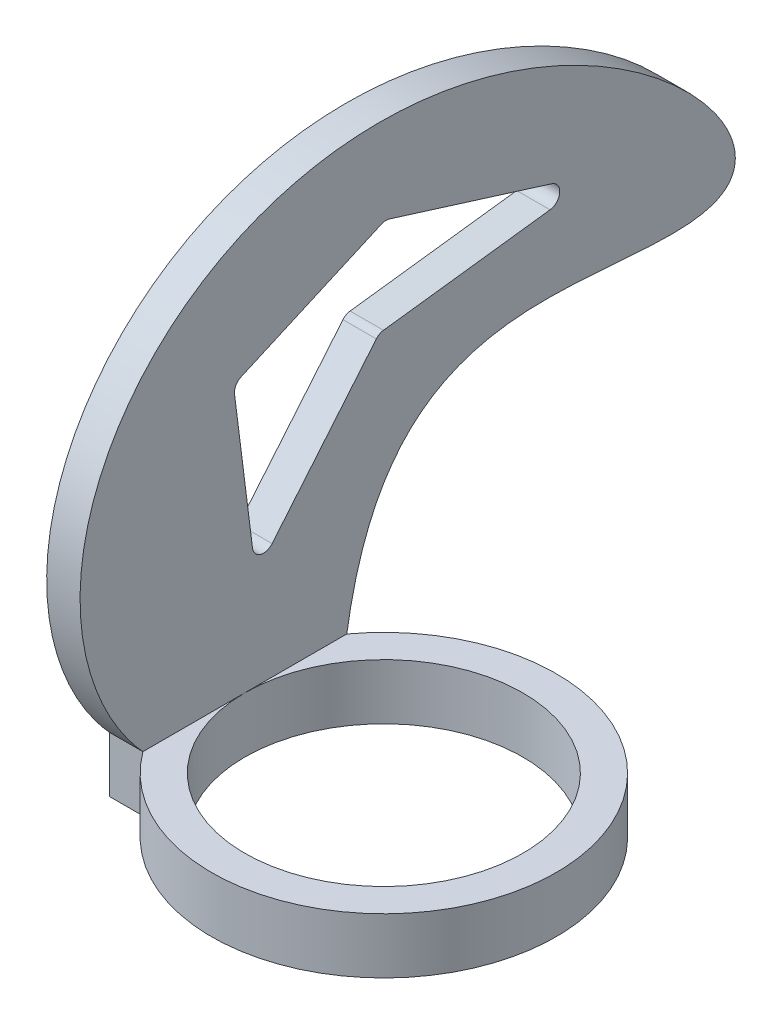
ISO-10303-21;
HEADER;
FILE_DESCRIPTION(('STEP AP214'),'2;1');
FILE_NAME('part.step','',(''),(''),'','','');
FILE_SCHEMA(('AUTOMOTIVE_DESIGN { 1 0 10303 214 1 1 1 1 }'));
ENDSEC;
DATA;
#1=APPLICATION_CONTEXT('core data for automotive mechanical design processes');
#2=APPLICATION_PROTOCOL_DEFINITION('international standard','automotive_design',2000,#1);
#3=PRODUCT_CONTEXT('',#1,'mechanical');
#4=PRODUCT('Part','Part','',(#3));
#5=PRODUCT_RELATED_PRODUCT_CATEGORY('part','',(#4));
#6=PRODUCT_DEFINITION_FORMATION('','',#4);
#7=PRODUCT_DEFINITION_CONTEXT('part definition',#1,'design');
#8=PRODUCT_DEFINITION('design','',#6,#7);
#9=PRODUCT_DEFINITION_SHAPE('','',#8);
#10=(LENGTH_UNIT() NAMED_UNIT(*) SI_UNIT(.MILLI.,.METRE.));
#11=(NAMED_UNIT(*) PLANE_ANGLE_UNIT() SI_UNIT($,.RADIAN.));
#12=(NAMED_UNIT(*) SI_UNIT($,.STERADIAN.) SOLID_ANGLE_UNIT());
#13=UNCERTAINTY_MEASURE_WITH_UNIT(LENGTH_MEASURE(1.E-05),#10,'distance_accuracy_value','');
#14=(GEOMETRIC_REPRESENTATION_CONTEXT(3) GLOBAL_UNCERTAINTY_ASSIGNED_CONTEXT((#13)) GLOBAL_UNIT_ASSIGNED_CONTEXT((#10,
#11,#12)) REPRESENTATION_CONTEXT('',''));
#15=CARTESIAN_POINT('',(0.,0.,0.));
#16=DIRECTION('',(0.,0.,1.));
#17=DIRECTION('',(1.,0.,0.));
#18=AXIS2_PLACEMENT_3D('',#15,#16,#17);
#19=CARTESIAN_POINT('',(0.,2.5,0.));
#20=DIRECTION('',(0.,-1.,0.));
#21=DIRECTION('',(0.,0.,-1.));
#22=AXIS2_PLACEMENT_3D('',#19,#20,#21);
#23=CYLINDRICAL_SURFACE('',#22,7.75);
#24=DIRECTION('',(0.,1.,0.));
#25=VECTOR('',#24,1.);
#26=CARTESIAN_POINT('',(-6.25,0.,4.58257569495584));
#27=LINE('',#26,#25);
#28=CARTESIAN_POINT('',(-6.25,0.,4.58257569495584));
#29=VERTEX_POINT('',#28);
#30=CARTESIAN_POINT('',(-6.25,2.5,4.58257569495584));
#31=VERTEX_POINT('',#30);
#32=EDGE_CURVE('E159',#29,#31,#27,.T.);
#33=ORIENTED_EDGE('',*,*,#32,.F.);
#34=CARTESIAN_POINT('',(0.,0.,0.));
#35=DIRECTION('',(0.,1.,0.));
#36=DIRECTION('',(0.,0.,1.));
#37=AXIS2_PLACEMENT_3D('',#34,#35,#36);
#38=CIRCLE('',#37,7.75);
#39=CARTESIAN_POINT('',(-6.25,0.,-4.58257569495584));
#40=VERTEX_POINT('',#39);
#41=EDGE_CURVE('E181',#29,#40,#38,.T.);
#42=ORIENTED_EDGE('',*,*,#41,.T.);
#43=DIRECTION('',(0.,1.,0.));
#44=VECTOR('',#43,1.);
#45=CARTESIAN_POINT('',(-6.25,0.,-4.58257569495584));
#46=LINE('',#45,#44);
#47=CARTESIAN_POINT('',(-6.25,2.5,-4.58257569495584));
#48=VERTEX_POINT('',#47);
#49=EDGE_CURVE('E180',#40,#48,#46,.T.);
#50=ORIENTED_EDGE('',*,*,#49,.T.);
#51=CARTESIAN_POINT('',(0.,2.5,0.));
#52=DIRECTION('',(0.,1.,0.));
#53=DIRECTION('',(0.,0.,1.));
#54=AXIS2_PLACEMENT_3D('',#51,#52,#53);
#55=CIRCLE('',#54,7.75);
#56=EDGE_CURVE('E173',#31,#48,#55,.T.);
#57=ORIENTED_EDGE('',*,*,#56,.F.);
#58=EDGE_LOOP('',(#33,#42,#50,#57));
#59=FACE_BOUND('',#58,.T.);
#60=ADVANCED_FACE('F33',(#59),#23,.T.);
#61=CARTESIAN_POINT('',(0.,2.5,0.));
#62=DIRECTION('',(0.,1.,0.));
#63=DIRECTION('',(0.,0.,1.));
#64=AXIS2_PLACEMENT_3D('',#61,#62,#63);
#65=PLANE('',#64);
#66=DIRECTION('',(0.,0.,-1.));
#67=VECTOR('',#66,1.);
#68=CARTESIAN_POINT('',(-6.25,2.5,-27.));
#69=LINE('',#68,#67);
#70=CARTESIAN_POINT('',(-6.25,2.5,0.));
#71=VERTEX_POINT('',#70);
#72=EDGE_CURVE('E155',#31,#71,#69,.T.);
#73=ORIENTED_EDGE('',*,*,#72,.F.);
#74=ORIENTED_EDGE('',*,*,#56,.T.);
#75=EDGE_CURVE('E156',#71,#48,#69,.T.);
#76=ORIENTED_EDGE('',*,*,#75,.F.);
#77=CARTESIAN_POINT('',(0.,2.5,0.));
#78=DIRECTION('',(0.,1.,0.));
#79=DIRECTION('',(0.,0.,1.));
#80=AXIS2_PLACEMENT_3D('',#77,#78,#79);
#81=CIRCLE('',#80,6.25);
#82=EDGE_CURVE('E175',#71,#71,#81,.T.);
#83=ORIENTED_EDGE('',*,*,#82,.F.);
#84=EDGE_LOOP('',(#73,#74,#76,#83));
#85=FACE_BOUND('',#84,.T.);
#86=ADVANCED_FACE('F172',(#85),#65,.T.);
#87=CARTESIAN_POINT('',(0.,0.,0.));
#88=DIRECTION('',(0.,1.,0.));
#89=DIRECTION('',(0.,0.,1.));
#90=AXIS2_PLACEMENT_3D('',#87,#88,#89);
#91=PLANE('',#90);
#92=CARTESIAN_POINT('',(0.,0.,0.));
#93=DIRECTION('',(0.,1.,0.));
#94=DIRECTION('',(0.,0.,1.));
#95=AXIS2_PLACEMENT_3D('',#92,#93,#94);
#96=CIRCLE('',#95,6.25);
#97=CARTESIAN_POINT('',(0.,0.,6.25));
#98=VERTEX_POINT('',#97);
#99=EDGE_CURVE('E166',#98,#98,#96,.T.);
#100=ORIENTED_EDGE('',*,*,#99,.T.);
#101=EDGE_LOOP('',(#100));
#102=FACE_BOUND('',#101,.T.);
#103=DIRECTION('',(1.,0.,0.));
#104=VECTOR('',#103,1.);
#105=CARTESIAN_POINT('',(-6.25,0.,-4.58257569495584));
#106=LINE('',#105,#104);
#107=CARTESIAN_POINT('',(-7.75,0.,-4.58257569495584));
#108=VERTEX_POINT('',#107);
#109=EDGE_CURVE('E470',#108,#40,#106,.T.);
#110=ORIENTED_EDGE('',*,*,#109,.T.);
#111=ORIENTED_EDGE('',*,*,#41,.F.);
#112=DIRECTION('',(-1.,0.,0.));
#113=VECTOR('',#112,1.);
#114=CARTESIAN_POINT('',(-6.25,0.,4.58257569495584));
#115=LINE('',#114,#113);
#116=CARTESIAN_POINT('',(-7.75,0.,4.58257569495584));
#117=VERTEX_POINT('',#116);
#118=EDGE_CURVE('E161',#29,#117,#115,.T.);
#119=ORIENTED_EDGE('',*,*,#118,.T.);
#120=DIRECTION('',(0.,0.,-1.));
#121=VECTOR('',#120,1.);
#122=CARTESIAN_POINT('',(-7.75,0.,-4.58257569495584));
#123=LINE('',#122,#121);
#124=EDGE_CURVE('E472',#117,#108,#123,.T.);
#125=ORIENTED_EDGE('',*,*,#124,.T.);
#126=EDGE_LOOP('',(#110,#111,#119,#125));
#127=FACE_BOUND('',#126,.T.);
#128=ADVANCED_FACE('F295',(#102,#127),#91,.F.);
#129=CARTESIAN_POINT('',(0.,2.5,0.));
#130=DIRECTION('',(0.,-1.,0.));
#131=DIRECTION('',(0.,0.,-1.));
#132=AXIS2_PLACEMENT_3D('',#129,#130,#131);
#133=CYLINDRICAL_SURFACE('',#132,6.25);
#134=ORIENTED_EDGE('',*,*,#99,.F.);
#135=EDGE_LOOP('',(#134));
#136=FACE_BOUND('',#135,.T.);
#137=ORIENTED_EDGE('',*,*,#82,.T.);
#138=EDGE_LOOP('',(#137));
#139=FACE_BOUND('',#138,.T.);
#140=ADVANCED_FACE('F292',(#136,#139),#133,.F.);
#141=CARTESIAN_POINT('',(-6.25,22.5,-27.));
#142=DIRECTION('',(-1.,0.,0.));
#143=DIRECTION('',(0.,0.,1.));
#144=AXIS2_PLACEMENT_3D('',#141,#142,#143);
#145=PLANE('',#144);
#146=DIRECTION('',(0.,-0.125360280156999,0.992111284160683));
#147=VECTOR('',#146,1.);
#148=CARTESIAN_POINT('',(-6.25,14.735802895455,-16.0040110855277));
#149=LINE('',#148,#147);
#150=CARTESIAN_POINT('',(-6.25,14.4474353196458,-13.7218470253644));
#151=VERTEX_POINT('',#150);
#152=CARTESIAN_POINT('',(-6.25,13.5011083094265,-6.23253937409876));
#153=VERTEX_POINT('',#152);
#154=EDGE_CURVE('E241',#151,#153,#149,.T.);
#155=ORIENTED_EDGE('',*,*,#154,.T.);
#156=CARTESIAN_POINT('',(-6.25,13.0050526673462,-6.29521951417726));
#157=DIRECTION('',(-1.,0.,0.));
#158=DIRECTION('',(0.,0.,1.));
#159=AXIS2_PLACEMENT_3D('',#156,#157,#158);
#160=CIRCLE('',#159,0.5);
#161=CARTESIAN_POINT('',(-6.25,13.324994836851,-5.91098389873732));
#162=VERTEX_POINT('',#161);
#163=EDGE_CURVE('E203',#153,#162,#160,.F.);
#164=ORIENTED_EDGE('',*,*,#163,.T.);
#165=DIRECTION('',(0.,-0.76847123087988,0.639884339009763));
#166=VECTOR('',#165,1.);
#167=CARTESIAN_POINT('',(-6.25,13.47640831397,-6.03706163441586));
#168=LINE('',#167,#166);
#169=CARTESIAN_POINT('',(-6.25,7.69809557974773,-1.22562344915546));
#170=VERTEX_POINT('',#169);
#171=EDGE_CURVE('E247',#162,#170,#168,.T.);
#172=ORIENTED_EDGE('',*,*,#171,.T.);
#173=CARTESIAN_POINT('',(-6.25,8.01803774925262,-0.84138783371552));
#174=DIRECTION('',(-1.,0.,0.));
#175=DIRECTION('',(0.,0.,1.));
#176=AXIS2_PLACEMENT_3D('',#173,#174,#175);
#177=CIRCLE('',#176,0.5);
#178=CARTESIAN_POINT('',(-6.25,7.95535760917411,-0.345332191635179));
#179=VERTEX_POINT('',#178);
#180=EDGE_CURVE('E216',#170,#179,#177,.T.);
#181=ORIENTED_EDGE('',*,*,#180,.T.);
#182=DIRECTION('',(0.,0.992111284160683,0.125360280156999));
#183=VECTOR('',#182,1.);
#184=CARTESIAN_POINT('',(-6.25,6.8140926227116,-0.489539097372926));
#185=LINE('',#184,#183);
#186=CARTESIAN_POINT('',(-6.25,14.3664635917885,0.464756409238536));
#187=VERTEX_POINT('',#186);
#188=EDGE_CURVE('E250',#179,#187,#185,.T.);
#189=ORIENTED_EDGE('',*,*,#188,.T.);
#190=CARTESIAN_POINT('',(-6.25,14.429143731867,-0.0312992328418052));
#191=DIRECTION('',(-1.,0.,0.));
#192=DIRECTION('',(0.,0.,1.));
#193=AXIS2_PLACEMENT_3D('',#190,#191,#192);
#194=CIRCLE('',#193,0.5);
#195=CARTESIAN_POINT('',(-6.25,14.8864037271411,0.170971122677603));
#196=VERTEX_POINT('',#195);
#197=EDGE_CURVE('E220',#187,#196,#194,.T.);
#198=ORIENTED_EDGE('',*,*,#197,.T.);
#199=DIRECTION('',(0.,0.404540711038818,-0.91451999054816));
#200=VECTOR('',#199,1.);
#201=CARTESIAN_POINT('',(-6.25,14.735802895455,0.511425043412761));
#202=LINE('',#201,#200);
#203=CARTESIAN_POINT('',(-6.25,17.6810722521514,-6.14676195915422));
#204=VERTEX_POINT('',#203);
#205=EDGE_CURVE('E257',#196,#204,#202,.T.);
#206=ORIENTED_EDGE('',*,*,#205,.T.);
#207=CARTESIAN_POINT('',(-6.25,17.2238122568774,-6.34903231467363));
#208=DIRECTION('',(-1.,0.,0.));
#209=DIRECTION('',(0.,0.,1.));
#210=AXIS2_PLACEMENT_3D('',#207,#208,#209);
#211=CIRCLE('',#210,0.5);
#212=CARTESIAN_POINT('',(-6.25,17.7011283212104,-6.49792615178464));
#213=VERTEX_POINT('',#212);
#214=EDGE_CURVE('E55',#204,#213,#211,.T.);
#215=ORIENTED_EDGE('',*,*,#214,.T.);
#216=DIRECTION('',(0.,-0.297787674222027,-0.95463212866603));
#217=VECTOR('',#216,1.);
#218=CARTESIAN_POINT('',(-6.25,17.7570747405085,-6.31857605112884));
#219=LINE('',#218,#217);
#220=CARTESIAN_POINT('',(-6.25,15.4208070260592,-13.808060722397));
#221=VERTEX_POINT('',#220);
#222=EDGE_CURVE('E243',#213,#221,#219,.T.);
#223=ORIENTED_EDGE('',*,*,#222,.T.);
#224=CARTESIAN_POINT('',(-6.25,14.9434909617262,-13.6591668852859));
#225=DIRECTION('',(-1.,0.,0.));
#226=DIRECTION('',(0.,0.,1.));
#227=AXIS2_PLACEMENT_3D('',#224,#225,#226);
#228=CIRCLE('',#227,0.5);
#229=EDGE_CURVE('E11',#221,#151,#228,.T.);
#230=ORIENTED_EDGE('',*,*,#229,.T.);
#231=EDGE_LOOP('',(#155,#164,#172,#181,#189,#198,#206,#215,#223,#230));
#232=FACE_BOUND('',#231,.T.);
#233=ORIENTED_EDGE('',*,*,#75,.T.);
#234=CARTESIAN_POINT('',(-6.25,2.5,-4.58257569495584));
#235=CARTESIAN_POINT('',(-6.25,7.388757929224,-5.37555513974919));
#236=CARTESIAN_POINT('',(-6.25,17.9231020818627,-8.0761084256471));
#237=CARTESIAN_POINT('',(-6.25,15.2616923756117,-16.120207129994));
#238=CARTESIAN_POINT('',(-6.25,-0.0330722990327104,-31.4505619723562));
#239=CARTESIAN_POINT('',(-6.25,1.04473030731711,-33.3627441128845));
#240=CARTESIAN_POINT('',(-6.25,30.2633435600868,-22.7002608783238));
#241=CARTESIAN_POINT('',(-6.25,34.1189058818792,-4.9954181113927));
#242=CARTESIAN_POINT('',(-6.25,20.7559509515711,5.36816856320854));
#243=CARTESIAN_POINT('',(-6.25,17.4811110900972,9.6112144679168));
#244=CARTESIAN_POINT('',(-6.25,7.9856512308929,9.6112144679168));
#245=CARTESIAN_POINT('',(-6.25,2.5,4.58257569495584));
#246=B_SPLINE_CURVE_WITH_KNOTS('',11,(#234,#235,#236,#237,#238,#239,#240,#241,#242,#243,#244,
#245),.UNSPECIFIED.,.F.,.F.,(12,12),(0.,1.),.UNSPECIFIED.);
#247=EDGE_CURVE('E140',#48,#31,#246,.T.);
#248=ORIENTED_EDGE('',*,*,#247,.T.);
#249=ORIENTED_EDGE('',*,*,#72,.T.);
#250=EDGE_LOOP('',(#233,#248,#249));
#251=FACE_BOUND('',#250,.T.);
#252=ADVANCED_FACE('F153',(#232,#251),#145,.F.);
#253=CARTESIAN_POINT('',(-7.75,22.5,-27.));
#254=DIRECTION('',(1.,0.,0.));
#255=DIRECTION('',(0.,0.,-1.));
#256=AXIS2_PLACEMENT_3D('',#253,#254,#255);
#257=PLANE('',#256);
#258=DIRECTION('',(0.,-0.76847123087988,0.639884339009763));
#259=VECTOR('',#258,1.);
#260=CARTESIAN_POINT('',(-7.75,13.47640831397,-6.03706163441586));
#261=LINE('',#260,#259);
#262=CARTESIAN_POINT('',(-7.75,13.324994836851,-5.91098389873732));
#263=VERTEX_POINT('',#262);
#264=CARTESIAN_POINT('',(-7.75,7.69809557974773,-1.22562344915546));
#265=VERTEX_POINT('',#264);
#266=EDGE_CURVE('E260',#263,#265,#261,.T.);
#267=ORIENTED_EDGE('',*,*,#266,.F.);
#268=CARTESIAN_POINT('',(-7.75,13.0050526673462,-6.29521951417726));
#269=DIRECTION('',(1.,0.,0.));
#270=DIRECTION('',(0.,0.,-1.));
#271=AXIS2_PLACEMENT_3D('',#268,#269,#270);
#272=CIRCLE('',#271,0.5);
#273=CARTESIAN_POINT('',(-7.75,13.5011083094265,-6.23253937409876));
#274=VERTEX_POINT('',#273);
#275=EDGE_CURVE('E196',#263,#274,#272,.F.);
#276=ORIENTED_EDGE('',*,*,#275,.T.);
#277=DIRECTION('',(0.,-0.125360280156999,0.992111284160683));
#278=VECTOR('',#277,1.);
#279=CARTESIAN_POINT('',(-7.75,14.735802895455,-16.0040110855277));
#280=LINE('',#279,#278);
#281=CARTESIAN_POINT('',(-7.75,14.4474353196458,-13.7218470253644));
#282=VERTEX_POINT('',#281);
#283=EDGE_CURVE('E232',#282,#274,#280,.T.);
#284=ORIENTED_EDGE('',*,*,#283,.F.);
#285=CARTESIAN_POINT('',(-7.75,14.9434909617262,-13.6591668852859));
#286=DIRECTION('',(1.,0.,0.));
#287=DIRECTION('',(0.,0.,-1.));
#288=AXIS2_PLACEMENT_3D('',#285,#286,#287);
#289=CIRCLE('',#288,0.5);
#290=CARTESIAN_POINT('',(-7.75,15.4208070260592,-13.808060722397));
#291=VERTEX_POINT('',#290);
#292=EDGE_CURVE('E41',#282,#291,#289,.T.);
#293=ORIENTED_EDGE('',*,*,#292,.T.);
#294=DIRECTION('',(0.,-0.297787674222027,-0.95463212866603));
#295=VECTOR('',#294,1.);
#296=CARTESIAN_POINT('',(-7.75,17.7570747405085,-6.31857605112884));
#297=LINE('',#296,#295);
#298=CARTESIAN_POINT('',(-7.75,17.7011283212104,-6.49792615178464));
#299=VERTEX_POINT('',#298);
#300=EDGE_CURVE('E230',#299,#291,#297,.T.);
#301=ORIENTED_EDGE('',*,*,#300,.F.);
#302=CARTESIAN_POINT('',(-7.75,17.2238122568774,-6.34903231467363));
#303=DIRECTION('',(1.,0.,0.));
#304=DIRECTION('',(0.,0.,-1.));
#305=AXIS2_PLACEMENT_3D('',#302,#303,#304);
#306=CIRCLE('',#305,0.5);
#307=CARTESIAN_POINT('',(-7.75,17.6810722521514,-6.14676195915422));
#308=VERTEX_POINT('',#307);
#309=EDGE_CURVE('E222',#299,#308,#306,.T.);
#310=ORIENTED_EDGE('',*,*,#309,.T.);
#311=DIRECTION('',(0.,0.404540711038818,-0.91451999054816));
#312=VECTOR('',#311,1.);
#313=CARTESIAN_POINT('',(-7.75,14.735802895455,0.511425043412762));
#314=LINE('',#313,#312);
#315=CARTESIAN_POINT('',(-7.75,14.8864037271411,0.170971122677603));
#316=VERTEX_POINT('',#315);
#317=EDGE_CURVE('E252',#316,#308,#314,.T.);
#318=ORIENTED_EDGE('',*,*,#317,.F.);
#319=CARTESIAN_POINT('',(-7.75,14.429143731867,-0.031299232841805));
#320=DIRECTION('',(1.,0.,0.));
#321=DIRECTION('',(0.,0.,-1.));
#322=AXIS2_PLACEMENT_3D('',#319,#320,#321);
#323=CIRCLE('',#322,0.5);
#324=CARTESIAN_POINT('',(-7.75,14.3664635917885,0.464756409238536));
#325=VERTEX_POINT('',#324);
#326=EDGE_CURVE('E218',#316,#325,#323,.T.);
#327=ORIENTED_EDGE('',*,*,#326,.T.);
#328=DIRECTION('',(0.,0.992111284160683,0.125360280156999));
#329=VECTOR('',#328,1.);
#330=CARTESIAN_POINT('',(-7.75,6.8140926227116,-0.489539097372925));
#331=LINE('',#330,#329);
#332=CARTESIAN_POINT('',(-7.75,7.95535760917411,-0.345332191635179));
#333=VERTEX_POINT('',#332);
#334=EDGE_CURVE('E263',#333,#325,#331,.T.);
#335=ORIENTED_EDGE('',*,*,#334,.F.);
#336=CARTESIAN_POINT('',(-7.75,8.01803774925262,-0.84138783371552));
#337=DIRECTION('',(1.,0.,0.));
#338=DIRECTION('',(0.,0.,-1.));
#339=AXIS2_PLACEMENT_3D('',#336,#337,#338);
#340=CIRCLE('',#339,0.5);
#341=EDGE_CURVE('E214',#333,#265,#340,.T.);
#342=ORIENTED_EDGE('',*,*,#341,.T.);
#343=EDGE_LOOP('',(#267,#276,#284,#293,#301,#310,#318,#327,#335,#342));
#344=FACE_BOUND('',#343,.T.);
#345=DIRECTION('',(0.,1.,0.));
#346=VECTOR('',#345,1.);
#347=CARTESIAN_POINT('',(-7.75,0.,4.58257569495584));
#348=LINE('',#347,#346);
#349=CARTESIAN_POINT('',(-7.75,2.5,4.58257569495584));
#350=VERTEX_POINT('',#349);
#351=EDGE_CURVE('E167',#117,#350,#348,.T.);
#352=ORIENTED_EDGE('',*,*,#351,.T.);
#353=CARTESIAN_POINT('',(-7.75,2.5,-4.58257569495584));
#354=CARTESIAN_POINT('',(-7.75,7.388757929224,-5.37555513974919));
#355=CARTESIAN_POINT('',(-7.75,17.9231020818627,-8.0761084256471));
#356=CARTESIAN_POINT('',(-7.75,15.2616923756117,-16.120207129994));
#357=CARTESIAN_POINT('',(-7.75,-0.0330722990327104,-31.4505619723562));
#358=CARTESIAN_POINT('',(-7.75,1.04473030731711,-33.3627441128845));
#359=CARTESIAN_POINT('',(-7.75,30.2633435600868,-22.7002608783238));
#360=CARTESIAN_POINT('',(-7.75,34.1189058818792,-4.9954181113927));
#361=CARTESIAN_POINT('',(-7.75,20.7559509515711,5.36816856320854));
#362=CARTESIAN_POINT('',(-7.75,17.4811110900972,9.6112144679168));
#363=CARTESIAN_POINT('',(-7.75,7.9856512308929,9.6112144679168));
#364=CARTESIAN_POINT('',(-7.75,2.5,4.58257569495584));
#365=B_SPLINE_CURVE_WITH_KNOTS('',11,(#353,#354,#355,#356,#357,#358,#359,#360,#361,#362,#363,
#364),.UNSPECIFIED.,.F.,.F.,(12,12),(0.,1.),.UNSPECIFIED.);
#366=CARTESIAN_POINT('',(-7.75,2.5,-4.58257569495584));
#367=VERTEX_POINT('',#366);
#368=EDGE_CURVE('E143',#367,#350,#365,.T.);
#369=ORIENTED_EDGE('',*,*,#368,.F.);
#370=DIRECTION('',(0.,1.,0.));
#371=VECTOR('',#370,1.);
#372=CARTESIAN_POINT('',(-7.75,0.,-4.58257569495584));
#373=LINE('',#372,#371);
#374=EDGE_CURVE('E476',#108,#367,#373,.T.);
#375=ORIENTED_EDGE('',*,*,#374,.F.);
#376=ORIENTED_EDGE('',*,*,#124,.F.);
#377=EDGE_LOOP('',(#352,#369,#375,#376));
#378=FACE_BOUND('',#377,.T.);
#379=ADVANCED_FACE('F228',(#344,#378),#257,.F.);
#380=CARTESIAN_POINT('',(-6.25,0.,4.58257569495584));
#381=DIRECTION('',(0.,0.,-1.));
#382=DIRECTION('',(-1.,0.,0.));
#383=AXIS2_PLACEMENT_3D('',#380,#381,#382);
#384=PLANE('',#383);
#385=DIRECTION('',(-1.,0.,0.));
#386=VECTOR('',#385,1.);
#387=CARTESIAN_POINT('',(-6.25,2.5,4.58257569495584));
#388=LINE('',#387,#386);
#389=EDGE_CURVE('E137',#31,#350,#388,.T.);
#390=ORIENTED_EDGE('',*,*,#389,.T.);
#391=ORIENTED_EDGE('',*,*,#351,.F.);
#392=ORIENTED_EDGE('',*,*,#118,.F.);
#393=ORIENTED_EDGE('',*,*,#32,.T.);
#394=EDGE_LOOP('',(#390,#391,#392,#393));
#395=FACE_BOUND('',#394,.T.);
#396=ADVANCED_FACE('F160',(#395),#384,.F.);
#397=CARTESIAN_POINT('',(-6.25,0.,-4.58257569495584));
#398=DIRECTION('',(0.,0.,1.));
#399=DIRECTION('',(1.,0.,0.));
#400=AXIS2_PLACEMENT_3D('',#397,#398,#399);
#401=PLANE('',#400);
#402=DIRECTION('',(1.,0.,0.));
#403=VECTOR('',#402,1.);
#404=CARTESIAN_POINT('',(-6.25,2.5,-4.58257569495584));
#405=LINE('',#404,#403);
#406=EDGE_CURVE('E148',#367,#48,#405,.T.);
#407=ORIENTED_EDGE('',*,*,#406,.T.);
#408=ORIENTED_EDGE('',*,*,#49,.F.);
#409=ORIENTED_EDGE('',*,*,#109,.F.);
#410=ORIENTED_EDGE('',*,*,#374,.T.);
#411=EDGE_LOOP('',(#407,#408,#409,#410));
#412=FACE_BOUND('',#411,.T.);
#413=ADVANCED_FACE('F281',(#412),#401,.F.);
#414=DIRECTION('',(-1.,0.,0.));
#415=VECTOR('',#414,1.);
#416=SURFACE_OF_LINEAR_EXTRUSION('',#246,#415);
#417=ORIENTED_EDGE('',*,*,#368,.T.);
#418=ORIENTED_EDGE('',*,*,#389,.F.);
#419=ORIENTED_EDGE('',*,*,#247,.F.);
#420=ORIENTED_EDGE('',*,*,#406,.F.);
#421=EDGE_LOOP('',(#417,#418,#419,#420));
#422=FACE_BOUND('',#421,.T.);
#423=ADVANCED_FACE('F139',(#422),#416,.F.);
#424=CARTESIAN_POINT('',(-6.25,17.7570747405085,-6.31857605112884));
#425=DIRECTION('',(0.,0.95463212866603,-0.297787674222027));
#426=DIRECTION('',(0.,0.297787674222027,0.95463212866603));
#427=AXIS2_PLACEMENT_3D('',#424,#425,#426);
#428=PLANE('',#427);
#429=ORIENTED_EDGE('',*,*,#222,.F.);
#430=DIRECTION('',(-1.,0.,0.));
#431=VECTOR('',#430,1.);
#432=CARTESIAN_POINT('',(-7.75,17.7011283212104,-6.49792615178464));
#433=LINE('',#432,#431);
#434=EDGE_CURVE('E211',#213,#299,#433,.T.);
#435=ORIENTED_EDGE('',*,*,#434,.T.);
#436=ORIENTED_EDGE('',*,*,#300,.T.);
#437=DIRECTION('',(-1.,0.,0.));
#438=VECTOR('',#437,1.);
#439=CARTESIAN_POINT('',(-6.25,15.4208070260592,-13.808060722397));
#440=LINE('',#439,#438);
#441=EDGE_CURVE('E48',#291,#221,#440,.F.);
#442=ORIENTED_EDGE('',*,*,#441,.T.);
#443=EDGE_LOOP('',(#429,#435,#436,#442));
#444=FACE_BOUND('',#443,.T.);
#445=ADVANCED_FACE('F235',(#444),#428,.F.);
#446=CARTESIAN_POINT('',(-6.25,14.735802895455,0.511425043412761));
#447=DIRECTION('',(0.,0.91451999054816,0.404540711038818));
#448=DIRECTION('',(0.,-0.404540711038818,0.91451999054816));
#449=AXIS2_PLACEMENT_3D('',#446,#447,#448);
#450=PLANE('',#449);
#451=ORIENTED_EDGE('',*,*,#205,.F.);
#452=DIRECTION('',(-1.,0.,0.));
#453=VECTOR('',#452,1.);
#454=CARTESIAN_POINT('',(-7.75,14.8864037271411,0.170971122677604));
#455=LINE('',#454,#453);
#456=EDGE_CURVE('E207',#196,#316,#455,.T.);
#457=ORIENTED_EDGE('',*,*,#456,.T.);
#458=ORIENTED_EDGE('',*,*,#317,.T.);
#459=DIRECTION('',(-1.,0.,0.));
#460=VECTOR('',#459,1.);
#461=CARTESIAN_POINT('',(-6.25,17.6810722521514,-6.14676195915422));
#462=LINE('',#461,#460);
#463=EDGE_CURVE('E205',#308,#204,#462,.F.);
#464=ORIENTED_EDGE('',*,*,#463,.T.);
#465=EDGE_LOOP('',(#451,#457,#458,#464));
#466=FACE_BOUND('',#465,.T.);
#467=ADVANCED_FACE('F325',(#466),#450,.F.);
#468=CARTESIAN_POINT('',(-6.25,6.8140926227116,-0.489539097372926));
#469=DIRECTION('',(0.,-0.125360280156999,0.992111284160683));
#470=DIRECTION('',(0.,-0.992111284160683,-0.125360280156999));
#471=AXIS2_PLACEMENT_3D('',#468,#469,#470);
#472=PLANE('',#471);
#473=ORIENTED_EDGE('',*,*,#188,.F.);
#474=DIRECTION('',(-1.,0.,0.));
#475=VECTOR('',#474,1.);
#476=CARTESIAN_POINT('',(-7.75,7.95535760917411,-0.345332191635179));
#477=LINE('',#476,#475);
#478=EDGE_CURVE('E188',#179,#333,#477,.T.);
#479=ORIENTED_EDGE('',*,*,#478,.T.);
#480=ORIENTED_EDGE('',*,*,#334,.T.);
#481=DIRECTION('',(-1.,0.,0.));
#482=VECTOR('',#481,1.);
#483=CARTESIAN_POINT('',(-6.25,14.3664635917885,0.464756409238536));
#484=LINE('',#483,#482);
#485=EDGE_CURVE('E176',#325,#187,#484,.F.);
#486=ORIENTED_EDGE('',*,*,#485,.T.);
#487=EDGE_LOOP('',(#473,#479,#480,#486));
#488=FACE_BOUND('',#487,.T.);
#489=ADVANCED_FACE('F332',(#488),#472,.F.);
#490=CARTESIAN_POINT('',(-6.25,13.47640831397,-6.03706163441586));
#491=DIRECTION('',(0.,-0.639884339009763,-0.76847123087988));
#492=DIRECTION('',(0.,0.768471230879881,-0.639884339009763));
#493=AXIS2_PLACEMENT_3D('',#490,#491,#492);
#494=PLANE('',#493);
#495=ORIENTED_EDGE('',*,*,#266,.T.);
#496=DIRECTION('',(-1.,0.,0.));
#497=VECTOR('',#496,1.);
#498=CARTESIAN_POINT('',(-6.25,7.69809557974773,-1.22562344915546));
#499=LINE('',#498,#497);
#500=EDGE_CURVE('E194',#265,#170,#499,.F.);
#501=ORIENTED_EDGE('',*,*,#500,.T.);
#502=ORIENTED_EDGE('',*,*,#171,.F.);
#503=DIRECTION('',(-1.,0.,0.));
#504=VECTOR('',#503,1.);
#505=CARTESIAN_POINT('',(-6.25,13.324994836851,-5.91098389873732));
#506=LINE('',#505,#504);
#507=EDGE_CURVE('E191',#162,#263,#506,.T.);
#508=ORIENTED_EDGE('',*,*,#507,.T.);
#509=EDGE_LOOP('',(#495,#501,#502,#508));
#510=FACE_BOUND('',#509,.T.);
#511=ADVANCED_FACE('F337',(#510),#494,.F.);
#512=CARTESIAN_POINT('',(-6.25,14.735802895455,-16.0040110855277));
#513=DIRECTION('',(0.,-0.992111284160683,-0.125360280156999));
#514=DIRECTION('',(0.,0.125360280156999,-0.992111284160683));
#515=AXIS2_PLACEMENT_3D('',#512,#513,#514);
#516=PLANE('',#515);
#517=ORIENTED_EDGE('',*,*,#283,.T.);
#518=DIRECTION('',(-1.,0.,0.));
#519=VECTOR('',#518,1.);
#520=CARTESIAN_POINT('',(-6.25,13.5011083094265,-6.23253937409876));
#521=LINE('',#520,#519);
#522=EDGE_CURVE('E201',#274,#153,#521,.F.);
#523=ORIENTED_EDGE('',*,*,#522,.T.);
#524=ORIENTED_EDGE('',*,*,#154,.F.);
#525=DIRECTION('',(-1.,0.,0.));
#526=VECTOR('',#525,1.);
#527=CARTESIAN_POINT('',(-7.75,14.4474353196458,-13.7218470253644));
#528=LINE('',#527,#526);
#529=EDGE_CURVE('E198',#151,#282,#528,.T.);
#530=ORIENTED_EDGE('',*,*,#529,.T.);
#531=EDGE_LOOP('',(#517,#523,#524,#530));
#532=FACE_BOUND('',#531,.T.);
#533=ADVANCED_FACE('F245',(#532),#516,.F.);
#534=CARTESIAN_POINT('',(-6.25,8.01803774925262,-0.84138783371552));
#535=DIRECTION('',(1.,0.,0.));
#536=DIRECTION('',(0.,0.,-1.));
#537=AXIS2_PLACEMENT_3D('',#534,#535,#536);
#538=CYLINDRICAL_SURFACE('',#537,0.5);
#539=ORIENTED_EDGE('',*,*,#180,.F.);
#540=ORIENTED_EDGE('',*,*,#500,.F.);
#541=ORIENTED_EDGE('',*,*,#341,.F.);
#542=ORIENTED_EDGE('',*,*,#478,.F.);
#543=EDGE_LOOP('',(#539,#540,#541,#542));
#544=FACE_BOUND('',#543,.T.);
#545=ADVANCED_FACE('F304',(#544),#538,.F.);
#546=CARTESIAN_POINT('',(-6.25,13.0050526673462,-6.29521951417726));
#547=DIRECTION('',(-1.,0.,0.));
#548=DIRECTION('',(0.,0.,1.));
#549=AXIS2_PLACEMENT_3D('',#546,#547,#548);
#550=CYLINDRICAL_SURFACE('',#549,0.5);
#551=ORIENTED_EDGE('',*,*,#163,.F.);
#552=ORIENTED_EDGE('',*,*,#522,.F.);
#553=ORIENTED_EDGE('',*,*,#275,.F.);
#554=ORIENTED_EDGE('',*,*,#507,.F.);
#555=EDGE_LOOP('',(#551,#552,#553,#554));
#556=FACE_BOUND('',#555,.T.);
#557=ADVANCED_FACE('F307',(#556),#550,.T.);
#558=CARTESIAN_POINT('',(-6.25,14.429143731867,-0.0312992328418052));
#559=DIRECTION('',(1.,0.,0.));
#560=DIRECTION('',(0.,0.,-1.));
#561=AXIS2_PLACEMENT_3D('',#558,#559,#560);
#562=CYLINDRICAL_SURFACE('',#561,0.5);
#563=ORIENTED_EDGE('',*,*,#197,.F.);
#564=ORIENTED_EDGE('',*,*,#485,.F.);
#565=ORIENTED_EDGE('',*,*,#326,.F.);
#566=ORIENTED_EDGE('',*,*,#456,.F.);
#567=EDGE_LOOP('',(#563,#564,#565,#566));
#568=FACE_BOUND('',#567,.T.);
#569=ADVANCED_FACE('F311',(#568),#562,.F.);
#570=CARTESIAN_POINT('',(-6.25,17.2238122568774,-6.34903231467363));
#571=DIRECTION('',(1.,0.,0.));
#572=DIRECTION('',(0.,0.,-1.));
#573=AXIS2_PLACEMENT_3D('',#570,#571,#572);
#574=CYLINDRICAL_SURFACE('',#573,0.5);
#575=ORIENTED_EDGE('',*,*,#214,.F.);
#576=ORIENTED_EDGE('',*,*,#463,.F.);
#577=ORIENTED_EDGE('',*,*,#309,.F.);
#578=ORIENTED_EDGE('',*,*,#434,.F.);
#579=EDGE_LOOP('',(#575,#576,#577,#578));
#580=FACE_BOUND('',#579,.T.);
#581=ADVANCED_FACE('F314',(#580),#574,.F.);
#582=CARTESIAN_POINT('',(-6.25,14.9434909617262,-13.6591668852859));
#583=DIRECTION('',(1.,0.,0.));
#584=DIRECTION('',(0.,0.,-1.));
#585=AXIS2_PLACEMENT_3D('',#582,#583,#584);
#586=CYLINDRICAL_SURFACE('',#585,0.5);
#587=ORIENTED_EDGE('',*,*,#229,.F.);
#588=ORIENTED_EDGE('',*,*,#441,.F.);
#589=ORIENTED_EDGE('',*,*,#292,.F.);
#590=ORIENTED_EDGE('',*,*,#529,.F.);
#591=EDGE_LOOP('',(#587,#588,#589,#590));
#592=FACE_BOUND('',#591,.T.);
#593=ADVANCED_FACE('F35',(#592),#586,.F.);
#594=CLOSED_SHELL('',(#60,#86,#128,#140,#252,#379,#396,#413,#423,#445,#467,#489,#511,#533,#545,
#557,#569,#581,#593));
#595=MANIFOLD_SOLID_BREP('B2',#594);
#596=ADVANCED_BREP_SHAPE_REPRESENTATION('',(#18,#595),#14);
#597=SHAPE_DEFINITION_REPRESENTATION(#9,#596);
ENDSEC;
END-ISO-10303-21;
